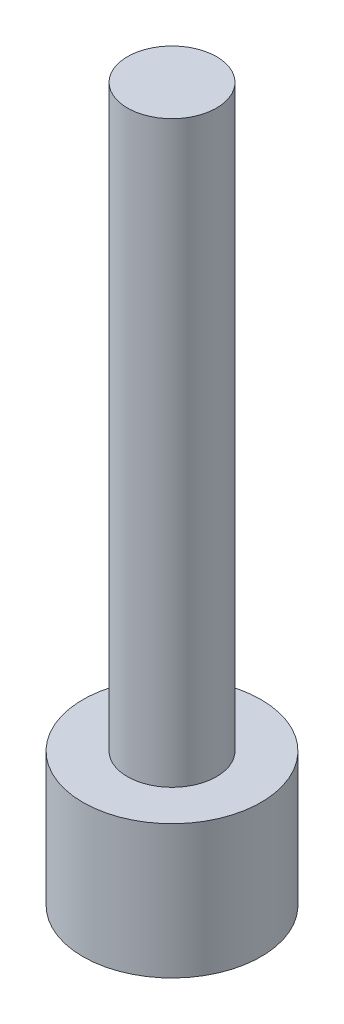
ISO-10303-21;
HEADER;
FILE_DESCRIPTION(('STEP AP214'),'2;1');
FILE_NAME('part.step','',(''),(''),'','','');
FILE_SCHEMA(('AUTOMOTIVE_DESIGN { 1 0 10303 214 1 1 1 1 }'));
ENDSEC;
DATA;
#1=APPLICATION_CONTEXT('core data for automotive mechanical design processes');
#2=APPLICATION_PROTOCOL_DEFINITION('international standard','automotive_design',2000,#1);
#3=PRODUCT_CONTEXT('',#1,'mechanical');
#4=PRODUCT('Part','Part','',(#3));
#5=PRODUCT_RELATED_PRODUCT_CATEGORY('part','',(#4));
#6=PRODUCT_DEFINITION_FORMATION('','',#4);
#7=PRODUCT_DEFINITION_CONTEXT('part definition',#1,'design');
#8=PRODUCT_DEFINITION('design','',#6,#7);
#9=PRODUCT_DEFINITION_SHAPE('','',#8);
#10=(LENGTH_UNIT() NAMED_UNIT(*) SI_UNIT(.MILLI.,.METRE.));
#11=(NAMED_UNIT(*) PLANE_ANGLE_UNIT() SI_UNIT($,.RADIAN.));
#12=(NAMED_UNIT(*) SI_UNIT($,.STERADIAN.) SOLID_ANGLE_UNIT());
#13=UNCERTAINTY_MEASURE_WITH_UNIT(LENGTH_MEASURE(1.E-05),#10,'distance_accuracy_value','');
#14=(GEOMETRIC_REPRESENTATION_CONTEXT(3) GLOBAL_UNCERTAINTY_ASSIGNED_CONTEXT((#13)) GLOBAL_UNIT_ASSIGNED_CONTEXT((#10,
#11,#12)) REPRESENTATION_CONTEXT('',''));
#15=CARTESIAN_POINT('',(0.,0.,0.));
#16=DIRECTION('',(0.,0.,1.));
#17=DIRECTION('',(1.,0.,0.));
#18=AXIS2_PLACEMENT_3D('',#15,#16,#17);
#19=CARTESIAN_POINT('',(0.,13.,0.));
#20=DIRECTION('',(0.,-1.,0.));
#21=DIRECTION('',(0.,0.,-1.));
#22=AXIS2_PLACEMENT_3D('',#19,#20,#21);
#23=CYLINDRICAL_SURFACE('',#22,1.);
#24=CARTESIAN_POINT('',(0.,13.,0.));
#25=DIRECTION('',(0.,1.,0.));
#26=DIRECTION('',(0.,0.,1.));
#27=AXIS2_PLACEMENT_3D('',#24,#25,#26);
#28=CIRCLE('',#27,1.);
#29=CARTESIAN_POINT('',(0.,13.,-1.));
#30=VERTEX_POINT('',#29);
#31=EDGE_CURVE('E10',#30,#30,#28,.T.);
#32=CARTESIAN_POINT('',(0.,0.,0.));
#33=DIRECTION('',(0.,-1.,0.));
#34=DIRECTION('',(0.,0.,-1.));
#35=AXIS2_PLACEMENT_3D('',#32,#33,#34);
#36=CIRCLE('',#35,1.);
#37=CARTESIAN_POINT('',(0.,0.,-1.));
#38=VERTEX_POINT('',#37);
#39=EDGE_CURVE('E37',#38,#38,#36,.T.);
#40=CARTESIAN_POINT('',(0.,13.,-1.));
#41=CARTESIAN_POINT('',(0.,12.8645833333333,-1.));
#42=CARTESIAN_POINT('',(0.,12.7291666666667,-1.));
#43=CARTESIAN_POINT('',(0.,12.4583333333333,-1.));
#44=CARTESIAN_POINT('',(0.,12.3229166666667,-1.));
#45=CARTESIAN_POINT('',(0.,12.0520833333333,-1.));
#46=CARTESIAN_POINT('',(0.,11.9166666666667,-1.));
#47=CARTESIAN_POINT('',(0.,11.6458333333333,-1.));
#48=CARTESIAN_POINT('',(0.,11.5104166666667,-1.));
#49=CARTESIAN_POINT('',(0.,11.2395833333333,-1.));
#50=CARTESIAN_POINT('',(0.,11.1041666666667,-1.));
#51=CARTESIAN_POINT('',(0.,10.8333333333333,-1.));
#52=CARTESIAN_POINT('',(0.,10.6979166666667,-1.));
#53=CARTESIAN_POINT('',(0.,10.4270833333333,-1.));
#54=CARTESIAN_POINT('',(0.,10.2916666666667,-1.));
#55=CARTESIAN_POINT('',(0.,10.0208333333333,-1.));
#56=CARTESIAN_POINT('',(0.,9.88541666666667,-1.));
#57=CARTESIAN_POINT('',(0.,9.61458333333333,-1.));
#58=CARTESIAN_POINT('',(0.,9.47916666666667,-1.));
#59=CARTESIAN_POINT('',(0.,9.20833333333333,-1.));
#60=CARTESIAN_POINT('',(0.,9.07291666666666,-1.));
#61=CARTESIAN_POINT('',(0.,8.80208333333333,-1.));
#62=CARTESIAN_POINT('',(0.,8.66666666666667,-1.));
#63=CARTESIAN_POINT('',(0.,8.39583333333333,-1.));
#64=CARTESIAN_POINT('',(0.,8.26041666666667,-1.));
#65=CARTESIAN_POINT('',(0.,7.98958333333333,-1.));
#66=CARTESIAN_POINT('',(0.,7.85416666666667,-1.));
#67=CARTESIAN_POINT('',(0.,7.58333333333333,-1.));
#68=CARTESIAN_POINT('',(0.,7.44791666666667,-1.));
#69=CARTESIAN_POINT('',(0.,7.17708333333333,-1.));
#70=CARTESIAN_POINT('',(0.,7.04166666666667,-1.));
#71=CARTESIAN_POINT('',(0.,6.77083333333333,-1.));
#72=CARTESIAN_POINT('',(0.,6.63541666666667,-1.));
#73=CARTESIAN_POINT('',(0.,6.36458333333333,-1.));
#74=CARTESIAN_POINT('',(0.,6.22916666666667,-1.));
#75=CARTESIAN_POINT('',(0.,5.95833333333333,-1.));
#76=CARTESIAN_POINT('',(0.,5.82291666666667,-1.));
#77=CARTESIAN_POINT('',(0.,5.55208333333333,-1.));
#78=CARTESIAN_POINT('',(0.,5.41666666666667,-1.));
#79=CARTESIAN_POINT('',(0.,5.14583333333333,-1.));
#80=CARTESIAN_POINT('',(0.,5.01041666666667,-1.));
#81=CARTESIAN_POINT('',(0.,4.73958333333333,-1.));
#82=CARTESIAN_POINT('',(0.,4.60416666666667,-1.));
#83=CARTESIAN_POINT('',(0.,4.33333333333333,-1.));
#84=CARTESIAN_POINT('',(0.,4.19791666666667,-1.));
#85=CARTESIAN_POINT('',(0.,3.92708333333333,-1.));
#86=CARTESIAN_POINT('',(0.,3.79166666666667,-1.));
#87=CARTESIAN_POINT('',(0.,3.52083333333333,-1.));
#88=CARTESIAN_POINT('',(0.,3.38541666666667,-1.));
#89=CARTESIAN_POINT('',(0.,3.11458333333333,-1.));
#90=CARTESIAN_POINT('',(0.,2.97916666666667,-1.));
#91=CARTESIAN_POINT('',(0.,2.70833333333333,-1.));
#92=CARTESIAN_POINT('',(0.,2.57291666666667,-1.));
#93=CARTESIAN_POINT('',(0.,2.30208333333333,-1.));
#94=CARTESIAN_POINT('',(0.,2.16666666666667,-1.));
#95=CARTESIAN_POINT('',(0.,1.89583333333333,-1.));
#96=CARTESIAN_POINT('',(0.,1.76041666666667,-1.));
#97=CARTESIAN_POINT('',(0.,1.48958333333333,-1.));
#98=CARTESIAN_POINT('',(0.,1.35416666666667,-1.));
#99=CARTESIAN_POINT('',(0.,1.08333333333333,-1.));
#100=CARTESIAN_POINT('',(0.,0.947916666666667,-1.));
#101=CARTESIAN_POINT('',(0.,0.677083333333334,-1.));
#102=CARTESIAN_POINT('',(0.,0.541666666666667,-1.));
#103=CARTESIAN_POINT('',(0.,0.270833333333334,-1.));
#104=CARTESIAN_POINT('',(0.,0.135416666666667,-1.));
#105=CARTESIAN_POINT('',(0.,0.,-1.));
#106=B_SPLINE_CURVE_WITH_KNOTS('',3,(#40,#41,#42,#43,#44,#45,#46,#47,#48,#49,#50,#51,#52,#53,
#54,#55,#56,#57,#58,#59,#60,#61,#62,#63,#64,#65,#66,#67,#68,#69,#70,#71,#72,#73,#74,#75,#76,#77,
#78,#79,#80,#81,#82,#83,#84,#85,#86,#87,#88,#89,#90,#91,#92,#93,#94,#95,#96,#97,#98,#99,#100,
#101,#102,#103,#104,#105),.UNSPECIFIED.,.F.,.F.,(4,2,2,2,2,2,2,2,2,2,2,2,2,2,2,2,2,2,2,2,2,2,2,
2,2,2,2,2,2,2,2,2,4),(0.,0.40625,0.812500000000001,1.21875,1.625,2.03125,2.4375,2.84375,3.25,
3.65625,4.0625,4.46875,4.875,5.28125,5.6875,6.09375,6.5,6.90625,7.3125,7.71875,8.125,8.53125,
8.9375,9.34375,9.75,10.15625,10.5625,10.96875,11.375,11.78125,12.1875,12.59375,13.),.UNSPECIFIED.);
#107=EDGE_CURVE('BSEAM31',#30,#38,#106,.T.);
#108=ORIENTED_EDGE('',*,*,#31,.F.);
#109=ORIENTED_EDGE('',*,*,#39,.F.);
#110=ORIENTED_EDGE('',*,*,#107,.T.);
#111=ORIENTED_EDGE('',*,*,#107,.F.);
#112=EDGE_LOOP('',(#108,#110,#109,#111));
#113=FACE_BOUND('',#112,.T.);
#114=ADVANCED_FACE('F31',(#113),#23,.T.);
#115=CARTESIAN_POINT('',(0.,13.,0.));
#116=DIRECTION('',(0.,1.,0.));
#117=DIRECTION('',(0.,0.,1.));
#118=AXIS2_PLACEMENT_3D('',#115,#116,#117);
#119=PLANE('',#118);
#120=ORIENTED_EDGE('',*,*,#31,.T.);
#121=EDGE_LOOP('',(#120));
#122=FACE_BOUND('',#121,.T.);
#123=ADVANCED_FACE('F64',(#122),#119,.T.);
#124=CARTESIAN_POINT('',(0.,-3.,0.));
#125=DIRECTION('',(0.,1.,0.));
#126=DIRECTION('',(0.,0.,1.));
#127=AXIS2_PLACEMENT_3D('',#124,#125,#126);
#128=CYLINDRICAL_SURFACE('',#127,2.);
#129=CARTESIAN_POINT('',(0.,-3.,0.));
#130=DIRECTION('',(0.,-1.,0.));
#131=DIRECTION('',(0.,0.,-1.));
#132=AXIS2_PLACEMENT_3D('',#129,#130,#131);
#133=CIRCLE('',#132,2.);
#134=CARTESIAN_POINT('',(0.,-3.,-2.));
#135=VERTEX_POINT('',#134);
#136=EDGE_CURVE('E41',#135,#135,#133,.T.);
#137=ORIENTED_EDGE('',*,*,#136,.F.);
#138=EDGE_LOOP('',(#137));
#139=FACE_BOUND('',#138,.T.);
#140=CARTESIAN_POINT('',(0.,0.,0.));
#141=DIRECTION('',(0.,-1.,0.));
#142=DIRECTION('',(0.,0.,-1.));
#143=AXIS2_PLACEMENT_3D('',#140,#141,#142);
#144=CIRCLE('',#143,2.);
#145=CARTESIAN_POINT('',(0.,0.,-2.));
#146=VERTEX_POINT('',#145);
#147=EDGE_CURVE('E45',#146,#146,#144,.T.);
#148=ORIENTED_EDGE('',*,*,#147,.T.);
#149=EDGE_LOOP('',(#148));
#150=FACE_BOUND('',#149,.T.);
#151=ADVANCED_FACE('F51',(#139,#150),#128,.T.);
#152=CARTESIAN_POINT('',(0.,-3.,0.));
#153=DIRECTION('',(0.,-1.,0.));
#154=DIRECTION('',(0.,0.,-1.));
#155=AXIS2_PLACEMENT_3D('',#152,#153,#154);
#156=PLANE('',#155);
#157=ORIENTED_EDGE('',*,*,#136,.T.);
#158=EDGE_LOOP('',(#157));
#159=FACE_BOUND('',#158,.T.);
#160=ADVANCED_FACE('F55',(#159),#156,.T.);
#161=CARTESIAN_POINT('',(0.,0.,0.));
#162=DIRECTION('',(0.,-1.,0.));
#163=DIRECTION('',(0.,0.,-1.));
#164=AXIS2_PLACEMENT_3D('',#161,#162,#163);
#165=PLANE('',#164);
#166=ORIENTED_EDGE('',*,*,#39,.T.);
#167=EDGE_LOOP('',(#166));
#168=FACE_BOUND('',#167,.T.);
#169=ORIENTED_EDGE('',*,*,#147,.F.);
#170=EDGE_LOOP('',(#169));
#171=FACE_BOUND('',#170,.T.);
#172=ADVANCED_FACE('F53',(#168,#171),#165,.F.);
#173=CLOSED_SHELL('',(#114,#123,#151,#160,#172));
#174=MANIFOLD_SOLID_BREP('B2',#173);
#175=ADVANCED_BREP_SHAPE_REPRESENTATION('',(#18,#174),#14);
#176=SHAPE_DEFINITION_REPRESENTATION(#9,#175);
ENDSEC;
END-ISO-10303-21;
